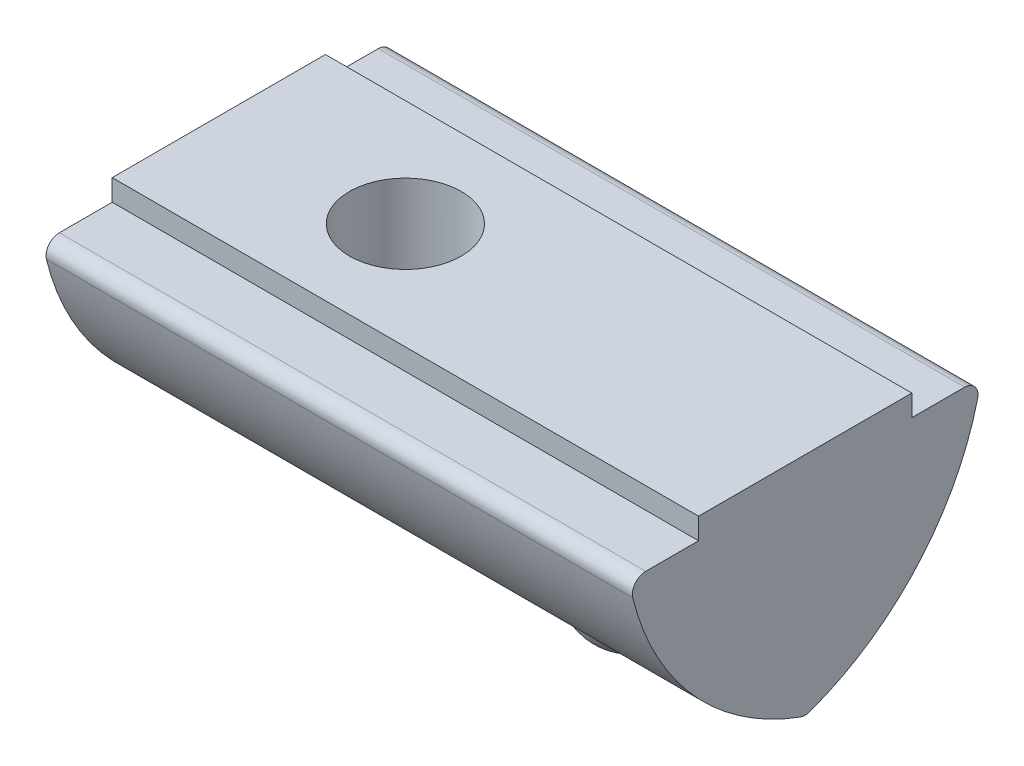
ISO-10303-21;
HEADER;
FILE_DESCRIPTION(('STEP AP214'),'2;1');
FILE_NAME('part.step','',(''),(''),'','','');
FILE_SCHEMA(('AUTOMOTIVE_DESIGN { 1 0 10303 214 1 1 1 1 }'));
ENDSEC;
DATA;
#1=APPLICATION_CONTEXT('core data for automotive mechanical design processes');
#2=APPLICATION_PROTOCOL_DEFINITION('international standard','automotive_design',2000,#1);
#3=PRODUCT_CONTEXT('',#1,'mechanical');
#4=PRODUCT('Part','Part','',(#3));
#5=PRODUCT_RELATED_PRODUCT_CATEGORY('part','',(#4));
#6=PRODUCT_DEFINITION_FORMATION('','',#4);
#7=PRODUCT_DEFINITION_CONTEXT('part definition',#1,'design');
#8=PRODUCT_DEFINITION('design','',#6,#7);
#9=PRODUCT_DEFINITION_SHAPE('','',#8);
#10=(LENGTH_UNIT() NAMED_UNIT(*) SI_UNIT(.MILLI.,.METRE.));
#11=(NAMED_UNIT(*) PLANE_ANGLE_UNIT() SI_UNIT($,.RADIAN.));
#12=(NAMED_UNIT(*) SI_UNIT($,.STERADIAN.) SOLID_ANGLE_UNIT());
#13=UNCERTAINTY_MEASURE_WITH_UNIT(LENGTH_MEASURE(1.E-05),#10,'distance_accuracy_value','');
#14=(GEOMETRIC_REPRESENTATION_CONTEXT(3) GLOBAL_UNCERTAINTY_ASSIGNED_CONTEXT((#13)) GLOBAL_UNIT_ASSIGNED_CONTEXT((#10,
#11,#12)) REPRESENTATION_CONTEXT('',''));
#15=CARTESIAN_POINT('',(0.,0.,0.));
#16=DIRECTION('',(0.,0.,1.));
#17=DIRECTION('',(1.,0.,0.));
#18=AXIS2_PLACEMENT_3D('',#15,#16,#17);
#19=CARTESIAN_POINT('',(11.,0.959183646170856,-3.24404758719933));
#20=DIRECTION('',(-1.,0.,0.));
#21=DIRECTION('',(0.,0.,1.));
#22=AXIS2_PLACEMENT_3D('',#19,#20,#21);
#23=CYLINDRICAL_SURFACE('',#22,10.);
#24=CARTESIAN_POINT('',(6.13456672228231,-8.43978417326976,0.170539346694701));
#25=CARTESIAN_POINT('',(6.14166085840546,-8.42248365589155,0.2181665216488));
#26=CARTESIAN_POINT('',(6.14665879114965,-8.40472523263232,0.265912873596706));
#27=CARTESIAN_POINT('',(6.15244603553675,-8.36839441075964,0.36134971753672));
#28=CARTESIAN_POINT('',(6.15323543931309,-8.3498220299744,0.409040210728841));
#29=CARTESIAN_POINT('',(6.14926881574427,-8.29306343560497,0.55151969439376));
#30=CARTESIAN_POINT('',(6.13818845474531,-8.25380996527598,0.645787766107359));
#31=CARTESIAN_POINT('',(6.09932704187162,-8.17377675893438,0.830159453493736));
#32=CARTESIAN_POINT('',(6.07153616583461,-8.13299613834079,0.920260585827474));
#33=CARTESIAN_POINT('',(5.99977773053169,-8.05149297446569,1.09379631955834));
#34=CARTESIAN_POINT('',(5.95581563761775,-8.01077041622156,1.17723316209691));
#35=CARTESIAN_POINT('',(5.85316012054617,-7.9316421563531,1.33425738872361));
#36=CARTESIAN_POINT('',(5.79462755953727,-7.89321649285333,1.40793968418131));
#37=CARTESIAN_POINT('',(5.66391812024963,-7.82019424272126,1.54432549342461));
#38=CARTESIAN_POINT('',(5.59174210091069,-7.78559741525739,1.60702969787028));
#39=CARTESIAN_POINT('',(5.43897843437988,-7.72363665580135,1.71704700919064));
#40=CARTESIAN_POINT('',(5.35888273628127,-7.69602661475469,1.76490379615891));
#41=CARTESIAN_POINT('',(5.19012341443222,-7.64788627358764,1.84718335212784));
#42=CARTESIAN_POINT('',(5.10146357337497,-7.62735286593229,1.8816120186446));
#43=CARTESIAN_POINT('',(4.92346558324823,-7.5956577718355,1.93432916047736));
#44=CARTESIAN_POINT('',(4.83444589045712,-7.58403404347301,1.95341632928833));
#45=CARTESIAN_POINT('',(4.65387123890333,-7.56906162249086,1.9779487731012));
#46=CARTESIAN_POINT('',(4.56231695630393,-7.56571074399448,1.98339765165752));
#47=CARTESIAN_POINT('',(4.3831607827305,-7.56746468579052,1.98053526468532));
#48=CARTESIAN_POINT('',(4.29554632740017,-7.5722389781528,1.97276188094082));
#49=CARTESIAN_POINT('',(4.12310505790691,-7.58932092764151,1.94472254921313));
#50=CARTESIAN_POINT('',(4.03827812192198,-7.60162825509171,1.92445714793111));
#51=CARTESIAN_POINT('',(3.87370324970061,-7.6330553938988,1.87204020240071));
#52=CARTESIAN_POINT('',(3.79395670268463,-7.65217705927514,1.83988542324555));
#53=CARTESIAN_POINT('',(3.64155632811411,-7.69617905215401,1.76460395255946));
#54=CARTESIAN_POINT('',(3.56890362479224,-7.72106029033459,1.72147552581705));
#55=CARTESIAN_POINT('',(3.42973117829016,-7.77636389030842,1.62354737391395));
#56=CARTESIAN_POINT('',(3.36354958016113,-7.80696094330033,1.56836628576492));
#57=CARTESIAN_POINT('',(3.2420111329999,-7.87152558903947,1.4488389283959));
#58=CARTESIAN_POINT('',(3.18665601784167,-7.90549372035791,1.38449119397414));
#59=CARTESIAN_POINT('',(3.08515563469648,-7.97722182893185,1.24451105673976));
#60=CARTESIAN_POINT('',(3.03966484752015,-8.01508747744342,1.16845814392302));
#61=CARTESIAN_POINT('',(2.96269470429401,-8.09138223257182,1.00977526054019));
#62=CARTESIAN_POINT('',(2.93122467629806,-8.12981169679074,0.927140954311092));
#63=CARTESIAN_POINT('',(2.88174558754636,-8.20758580144715,0.753427809688063));
#64=CARTESIAN_POINT('',(2.86442492833677,-8.24689080482885,0.662135244938334));
#65=CARTESIAN_POINT('',(2.84607991283625,-8.32320300699888,0.477141748099445));
#66=CARTESIAN_POINT('',(2.84502658124792,-8.36021417437015,0.383445395987207));
#67=CARTESIAN_POINT('',(2.85505798785469,-8.41062869408612,0.250016672212722));
#68=CARTESIAN_POINT('',(2.85951465204512,-8.42537502527711,0.210218321169013));
#69=CARTESIAN_POINT('',(2.86543327771759,-8.43978417326976,0.170539346694695));
#70=B_SPLINE_CURVE_WITH_KNOTS('',3,(#24,#25,#26,#27,#28,#29,#30,#31,#32,#33,#34,#35,#36,#37,#38,
#39,#40,#41,#42,#43,#44,#45,#46,#47,#48,#49,#50,#51,#52,#53,#54,#55,#56,#57,#58,#59,#60,#61,#62,
#63,#64,#65,#66,#67,#68,#69),.UNSPECIFIED.,.F.,.F.,(4,2,2,2,2,2,2,2,2,2,2,2,2,2,2,2,2,2,2,2,2,2,
4),(0.,0.153404302316358,0.306805246280148,0.613380981770518,0.92013713052628,1.22678968173144,
1.53019619043653,1.8335836041896,2.12399193236017,2.41427257165683,2.68823102528617,
2.96211708505643,3.22512592281603,3.48812325106292,3.75119218933334,4.01430275134187,
4.28741562449719,4.56057220124838,4.84840242317601,5.13642385451082,5.43774015580749,
5.73851969171597,5.86643517958048),.UNSPECIFIED.);
#71=CARTESIAN_POINT('',(6.1345965082198,-8.43971151209677,0.1707393466947));
#72=VERTEX_POINT('',#71);
#73=CARTESIAN_POINT('',(2.8654034917802,-8.43971151209677,0.170739346694701));
#74=VERTEX_POINT('',#73);
#75=EDGE_CURVE('E61',#72,#74,#70,.T.);
#76=ORIENTED_EDGE('',*,*,#75,.F.);
#77=DIRECTION('',(-1.,0.,0.));
#78=VECTOR('',#77,1.);
#79=CARTESIAN_POINT('',(11.,-8.43971151209677,0.170739346694701));
#80=LINE('',#79,#78);
#81=CARTESIAN_POINT('',(11.,-8.43971151209677,0.170739346694701));
#82=VERTEX_POINT('',#81);
#83=EDGE_CURVE('E75',#72,#82,#80,.F.);
#84=ORIENTED_EDGE('',*,*,#83,.T.);
#85=CARTESIAN_POINT('',(11.,0.959183646170856,-3.24404758719933));
#86=DIRECTION('',(1.,0.,0.));
#87=DIRECTION('',(0.,0.,-1.));
#88=AXIS2_PLACEMENT_3D('',#85,#86,#87);
#89=CIRCLE('',#88,10.);
#90=CARTESIAN_POINT('',(11.,-1.41890440243005,6.46907226345121));
#91=VERTEX_POINT('',#90);
#92=EDGE_CURVE('E322',#91,#82,#89,.T.);
#93=ORIENTED_EDGE('',*,*,#92,.F.);
#94=DIRECTION('',(-1.,0.,0.));
#95=VECTOR('',#94,1.);
#96=CARTESIAN_POINT('',(11.,-1.41890440243005,6.46907226345121));
#97=LINE('',#96,#95);
#98=CARTESIAN_POINT('',(-11.,-1.41890440243005,6.46907226345121));
#99=VERTEX_POINT('',#98);
#100=EDGE_CURVE('E185',#91,#99,#97,.T.);
#101=ORIENTED_EDGE('',*,*,#100,.T.);
#102=CARTESIAN_POINT('',(-11.,0.959183646170856,-3.24404758719933));
#103=DIRECTION('',(1.,0.,0.));
#104=DIRECTION('',(0.,0.,-1.));
#105=AXIS2_PLACEMENT_3D('',#102,#103,#104);
#106=CIRCLE('',#105,10.);
#107=CARTESIAN_POINT('',(-11.,-8.43971151209677,0.170739346694701));
#108=VERTEX_POINT('',#107);
#109=EDGE_CURVE('E306',#99,#108,#106,.T.);
#110=ORIENTED_EDGE('',*,*,#109,.T.);
#111=CARTESIAN_POINT('',(-6.0930475569108,-8.43971151209677,0.170739346694696));
#112=VERTEX_POINT('',#111);
#113=EDGE_CURVE('E190',#108,#112,#80,.F.);
#114=ORIENTED_EDGE('',*,*,#113,.T.);
#115=CARTESIAN_POINT('',(-6.0930475569108,-8.43971151209677,0.170739346694696));
#116=CARTESIAN_POINT('',(-6.08784951992059,-8.41657566040288,0.234429584835297));
#117=CARTESIAN_POINT('',(-6.07976877801095,-8.39287431099568,0.297635391447042));
#118=CARTESIAN_POINT('',(-6.05799933149116,-8.34455130127524,0.422694442950031));
#119=CARTESIAN_POINT('',(-6.0443123198008,-8.31992992082078,0.484548090217303));
#120=CARTESIAN_POINT('',(-5.99512173334344,-8.24505796955417,0.667372636824643));
#121=CARTESIAN_POINT('',(-5.95147140255796,-8.19372616021422,0.785808043261356));
#122=CARTESIAN_POINT('',(-5.84400139568146,-8.09047053687792,1.01263189371261));
#123=CARTESIAN_POINT('',(-5.78019681782185,-8.03854719399633,1.12102778031654));
#124=CARTESIAN_POINT('',(-5.63375255027643,-7.9365065307461,1.32538790498134));
#125=CARTESIAN_POINT('',(-5.5511024420098,-7.88639022719877,1.4213452202916));
#126=CARTESIAN_POINT('',(-5.36765406604185,-7.79054508274423,1.59873120819588));
#127=CARTESIAN_POINT('',(-5.26670904784925,-7.74485667571409,1.68003093677407));
#128=CARTESIAN_POINT('',(-5.0491155338509,-7.66193274333532,1.82381788813684));
#129=CARTESIAN_POINT('',(-4.93248217601335,-7.62468916132422,1.88632306032276));
#130=CARTESIAN_POINT('',(-4.69933957412089,-7.56567537930104,1.98373446213052));
#131=CARTESIAN_POINT('',(-4.58405076311003,-7.54270789371099,2.02081770732173));
#132=CARTESIAN_POINT('',(-4.34713778276227,-7.50913733888363,2.07465394341067));
#133=CARTESIAN_POINT('',(-4.22552290916532,-7.49851663471578,2.0914359320254));
#134=CARTESIAN_POINT('',(-3.9987309434421,-7.49145349827924,2.10260981382135));
#135=CARTESIAN_POINT('',(-3.89374271346917,-7.49316950209997,2.09990966318821));
#136=CARTESIAN_POINT('',(-3.68595642468966,-7.5063487573263,2.07900732408726));
#137=CARTESIAN_POINT('',(-3.58315822614996,-7.5178113849359,2.06080612770548));
#138=CARTESIAN_POINT('',(-3.38627273217212,-7.54889728854221,2.01079551828081));
#139=CARTESIAN_POINT('',(-3.29200555832934,-7.56821517805778,1.97949418992335));
#140=CARTESIAN_POINT('',(-3.11019385073335,-7.61357629202151,1.90470885257996));
#141=CARTESIAN_POINT('',(-3.02265100534786,-7.63962119839753,1.8612217966164));
#142=CARTESIAN_POINT('',(-2.8474734946188,-7.69971521208763,1.75868439124481));
#143=CARTESIAN_POINT('',(-2.76067397303569,-7.73429916853744,1.69852509739834));
#144=CARTESIAN_POINT('',(-2.59806660461083,-7.80776335288986,1.56701447237437));
#145=CARTESIAN_POINT('',(-2.52226577358756,-7.84664629540309,1.49565605740427));
#146=CARTESIAN_POINT('',(-2.37270858443049,-7.93260661563048,1.33259896759552));
#147=CARTESIAN_POINT('',(-2.30074783918822,-7.98006633600325,1.23945098957153));
#148=CARTESIAN_POINT('',(-2.1734970141286,-8.07598051351226,1.04288348682671));
#149=CARTESIAN_POINT('',(-2.11820885987611,-8.12443508485695,0.939462777511257));
#150=CARTESIAN_POINT('',(-2.02693105668447,-8.21886968245955,0.72789112094482));
#151=CARTESIAN_POINT('',(-1.99038013464362,-8.26487926329826,0.619997686141296));
#152=CARTESIAN_POINT('',(-1.94890394607111,-8.33204022259635,0.454159916513098));
#153=CARTESIAN_POINT('',(-1.93730169072364,-8.35412644678052,0.398192088825131));
#154=CARTESIAN_POINT('',(-1.91866823330907,-8.39753238759696,0.285192669931149));
#155=CARTESIAN_POINT('',(-1.91163817430702,-8.41885191129389,0.228160816378067));
#156=CARTESIAN_POINT('',(-1.9069524430892,-8.43971151209677,0.170739346694696));
#157=B_SPLINE_CURVE_WITH_KNOTS('',3,(#115,#116,#117,#118,#119,#120,#121,#122,#123,#124,#125,
#126,#127,#128,#129,#130,#131,#132,#133,#134,#135,#136,#137,#138,#139,#140,#141,#142,#143,#144,
#145,#146,#147,#148,#149,#150,#151,#152,#153,#154,#155,#156),.UNSPECIFIED.,.F.,.F.,(4,2,2,2,2,2,
2,2,2,2,2,2,2,2,2,2,2,2,2,2,4),(0.,0.203742262837634,0.407423047127448,0.814149184109984,
1.22057134846293,1.62721874675163,2.03728532546469,2.44695902446412,2.81450746204076,
3.18153028200054,3.49503643932938,3.80852253338545,4.11083664534663,4.41322641693205,
4.74531022420529,5.07760493775733,5.45675811331798,5.83595506159894,6.2030096225213,
6.38667827607127,6.57039282979267),.UNSPECIFIED.);
#158=CARTESIAN_POINT('',(-1.9069524430892,-8.43971151209677,0.1707393466947));
#159=VERTEX_POINT('',#158);
#160=EDGE_CURVE('E228',#112,#159,#157,.T.);
#161=ORIENTED_EDGE('',*,*,#160,.T.);
#162=EDGE_CURVE('E191',#159,#74,#80,.F.);
#163=ORIENTED_EDGE('',*,*,#162,.T.);
#164=EDGE_LOOP('',(#76,#84,#93,#101,#110,#114,#161,#163));
#165=FACE_BOUND('',#164,.T.);
#166=ADVANCED_FACE('F44',(#165),#23,.T.);
#167=CARTESIAN_POINT('',(11.,0.959183646170855,3.24404758719933));
#168=DIRECTION('',(-1.,0.,0.));
#169=DIRECTION('',(0.,0.,1.));
#170=AXIS2_PLACEMENT_3D('',#167,#168,#169);
#171=CYLINDRICAL_SURFACE('',#170,10.);
#172=DIRECTION('',(-1.,0.,0.));
#173=VECTOR('',#172,1.);
#174=CARTESIAN_POINT('',(11.,-8.43971151209677,-0.170739346694703));
#175=LINE('',#174,#173);
#176=CARTESIAN_POINT('',(11.,-8.43971151209677,-0.170739346694703));
#177=VERTEX_POINT('',#176);
#178=CARTESIAN_POINT('',(6.1345965082198,-8.43971151209677,-0.170739346694702));
#179=VERTEX_POINT('',#178);
#180=EDGE_CURVE('E161',#177,#179,#175,.T.);
#181=ORIENTED_EDGE('',*,*,#180,.T.);
#182=CARTESIAN_POINT('',(6.13456672228231,-8.43978417326976,-0.170539346694702));
#183=CARTESIAN_POINT('',(6.14166085840546,-8.42248365589155,-0.218166521648801));
#184=CARTESIAN_POINT('',(6.14665879114965,-8.40472523263231,-0.265912873596706));
#185=CARTESIAN_POINT('',(6.15244603553675,-8.36839441075964,-0.361349717536721));
#186=CARTESIAN_POINT('',(6.15323543931309,-8.3498220299744,-0.409040210728842));
#187=CARTESIAN_POINT('',(6.14926881574427,-8.29306343560497,-0.551519694393762));
#188=CARTESIAN_POINT('',(6.13818845474531,-8.25380996527598,-0.64578776610736));
#189=CARTESIAN_POINT('',(6.09932704187163,-8.17377675893437,-0.830159453493736));
#190=CARTESIAN_POINT('',(6.07153616583461,-8.13299613834079,-0.920260585827474));
#191=CARTESIAN_POINT('',(5.99977773053169,-8.05149297446569,-1.09379631955834));
#192=CARTESIAN_POINT('',(5.95581563761775,-8.01077041622156,-1.17723316209691));
#193=CARTESIAN_POINT('',(5.85316012054617,-7.9316421563531,-1.33425738872361));
#194=CARTESIAN_POINT('',(5.79462755953727,-7.89321649285333,-1.40793968418131));
#195=CARTESIAN_POINT('',(5.66391812024963,-7.82019424272126,-1.54432549342461));
#196=CARTESIAN_POINT('',(5.59174210091069,-7.78559741525739,-1.60702969787028));
#197=CARTESIAN_POINT('',(5.43897843437988,-7.72363665580135,-1.71704700919064));
#198=CARTESIAN_POINT('',(5.35888273628127,-7.6960266147547,-1.76490379615891));
#199=CARTESIAN_POINT('',(5.19012341443222,-7.64788627358764,-1.84718335212784));
#200=CARTESIAN_POINT('',(5.10146357337497,-7.62735286593229,-1.8816120186446));
#201=CARTESIAN_POINT('',(4.92346558324822,-7.5956577718355,-1.93432916047736));
#202=CARTESIAN_POINT('',(4.83444589045712,-7.58403404347301,-1.95341632928833));
#203=CARTESIAN_POINT('',(4.65387123890333,-7.56906162249086,-1.9779487731012));
#204=CARTESIAN_POINT('',(4.56231695630393,-7.56571074399448,-1.98339765165752));
#205=CARTESIAN_POINT('',(4.3831607827305,-7.56746468579052,-1.98053526468532));
#206=CARTESIAN_POINT('',(4.29554632740017,-7.5722389781528,-1.97276188094082));
#207=CARTESIAN_POINT('',(4.12310505790691,-7.58932092764151,-1.94472254921312));
#208=CARTESIAN_POINT('',(4.03827812192198,-7.60162825509171,-1.92445714793111));
#209=CARTESIAN_POINT('',(3.87370324970061,-7.6330553938988,-1.87204020240071));
#210=CARTESIAN_POINT('',(3.79395670268463,-7.65217705927514,-1.83988542324555));
#211=CARTESIAN_POINT('',(3.64155632811411,-7.69617905215401,-1.76460395255945));
#212=CARTESIAN_POINT('',(3.56890362479224,-7.72106029033459,-1.72147552581705));
#213=CARTESIAN_POINT('',(3.42973117829016,-7.77636389030842,-1.62354737391394));
#214=CARTESIAN_POINT('',(3.36354958016113,-7.80696094330033,-1.56836628576492));
#215=CARTESIAN_POINT('',(3.2420111329999,-7.87152558903947,-1.4488389283959));
#216=CARTESIAN_POINT('',(3.18665601784166,-7.90549372035791,-1.38449119397414));
#217=CARTESIAN_POINT('',(3.08515563469648,-7.97722182893185,-1.24451105673976));
#218=CARTESIAN_POINT('',(3.03966484752015,-8.01508747744342,-1.16845814392302));
#219=CARTESIAN_POINT('',(2.96269470429401,-8.09138223257182,-1.00977526054019));
#220=CARTESIAN_POINT('',(2.93122467629806,-8.12981169679074,-0.927140954311091));
#221=CARTESIAN_POINT('',(2.88174558754636,-8.20758580144715,-0.753427809688061));
#222=CARTESIAN_POINT('',(2.86442492833677,-8.24689080482885,-0.662135244938332));
#223=CARTESIAN_POINT('',(2.84607991283624,-8.32320300699888,-0.477141748099443));
#224=CARTESIAN_POINT('',(2.84502658124792,-8.36021417437015,-0.383445395987205));
#225=CARTESIAN_POINT('',(2.85505798785469,-8.41062869408612,-0.250016672212722));
#226=CARTESIAN_POINT('',(2.85951465204512,-8.42537502527712,-0.210218321169013));
#227=CARTESIAN_POINT('',(2.86543327771759,-8.43978417326976,-0.170539346694696));
#228=B_SPLINE_CURVE_WITH_KNOTS('',3,(#182,#183,#184,#185,#186,#187,#188,#189,#190,#191,#192,
#193,#194,#195,#196,#197,#198,#199,#200,#201,#202,#203,#204,#205,#206,#207,#208,#209,#210,#211,
#212,#213,#214,#215,#216,#217,#218,#219,#220,#221,#222,#223,#224,#225,#226,#227),.UNSPECIFIED.,
.F.,.F.,(4,2,2,2,2,2,2,2,2,2,2,2,2,2,2,2,2,2,2,2,2,2,4),(0.,0.153404302316357,0.306805246280148,
0.613380981770518,0.92013713052628,1.22678968173144,1.53019619043653,1.8335836041896,
2.12399193236017,2.41427257165683,2.68823102528617,2.96211708505643,3.22512592281603,
3.48812325106292,3.75119218933334,4.01430275134187,4.28741562449718,4.56057220124838,
4.84840242317601,5.13642385451082,5.43774015580749,5.73851969171597,5.86643517958048),.UNSPECIFIED.);
#229=CARTESIAN_POINT('',(2.8654034917802,-8.43971151209677,-0.170739346694702));
#230=VERTEX_POINT('',#229);
#231=EDGE_CURVE('E153',#179,#230,#228,.T.);
#232=ORIENTED_EDGE('',*,*,#231,.T.);
#233=CARTESIAN_POINT('',(-1.9069524430892,-8.43971151209677,-0.170739346694703));
#234=VERTEX_POINT('',#233);
#235=EDGE_CURVE('E163',#230,#234,#175,.T.);
#236=ORIENTED_EDGE('',*,*,#235,.T.);
#237=CARTESIAN_POINT('',(-6.0930475569108,-8.43971151209677,-0.170739346694707));
#238=CARTESIAN_POINT('',(-6.08784951992059,-8.41657566040287,-0.234429584835308));
#239=CARTESIAN_POINT('',(-6.07976877801095,-8.39287431099567,-0.297635391447054));
#240=CARTESIAN_POINT('',(-6.05799933149116,-8.34455130127524,-0.422694442950042));
#241=CARTESIAN_POINT('',(-6.0443123198008,-8.31992992082077,-0.484548090217315));
#242=CARTESIAN_POINT('',(-5.99512173334343,-8.24505796955416,-0.667372636824654));
#243=CARTESIAN_POINT('',(-5.95147140255796,-8.19372616021422,-0.785808043261368));
#244=CARTESIAN_POINT('',(-5.84400139568146,-8.09047053687791,-1.01263189371262));
#245=CARTESIAN_POINT('',(-5.78019681782185,-8.03854719399632,-1.12102778031655));
#246=CARTESIAN_POINT('',(-5.63375255027643,-7.93650653074609,-1.32538790498135));
#247=CARTESIAN_POINT('',(-5.55110244200979,-7.88639022719877,-1.42134522029161));
#248=CARTESIAN_POINT('',(-5.36765406604184,-7.79054508274423,-1.59873120819588));
#249=CARTESIAN_POINT('',(-5.26670904784924,-7.74485667571409,-1.68003093677408));
#250=CARTESIAN_POINT('',(-5.04911553385089,-7.66193274333532,-1.82381788813685));
#251=CARTESIAN_POINT('',(-4.93248217601333,-7.62468916132422,-1.88632306032277));
#252=CARTESIAN_POINT('',(-4.69933957412087,-7.56567537930104,-1.98373446213052));
#253=CARTESIAN_POINT('',(-4.58405076311001,-7.54270789371099,-2.02081770732173));
#254=CARTESIAN_POINT('',(-4.34713778276226,-7.50913733888362,-2.07465394341067));
#255=CARTESIAN_POINT('',(-4.22552290916531,-7.49851663471578,-2.0914359320254));
#256=CARTESIAN_POINT('',(-3.99873094344209,-7.49145349827924,-2.10260981382135));
#257=CARTESIAN_POINT('',(-3.89374271346916,-7.49316950209997,-2.09990966318821));
#258=CARTESIAN_POINT('',(-3.68595642468965,-7.5063487573263,-2.07900732408725));
#259=CARTESIAN_POINT('',(-3.58315822614995,-7.5178113849359,-2.06080612770548));
#260=CARTESIAN_POINT('',(-3.38627273217211,-7.54889728854221,-2.01079551828081));
#261=CARTESIAN_POINT('',(-3.29200555832933,-7.56821517805778,-1.97949418992334));
#262=CARTESIAN_POINT('',(-3.11019385073334,-7.61357629202152,-1.90470885257996));
#263=CARTESIAN_POINT('',(-3.02265100534785,-7.63962119839753,-1.86122179661639));
#264=CARTESIAN_POINT('',(-2.84747349461879,-7.69971521208764,-1.7586843912448));
#265=CARTESIAN_POINT('',(-2.76067397303568,-7.73429916853744,-1.69852509739833));
#266=CARTESIAN_POINT('',(-2.59806660461082,-7.80776335288987,-1.56701447237437));
#267=CARTESIAN_POINT('',(-2.52226577358755,-7.8466462954031,-1.49565605740426));
#268=CARTESIAN_POINT('',(-2.37270858443049,-7.93260661563048,-1.33259896759551));
#269=CARTESIAN_POINT('',(-2.30074783918822,-7.98006633600326,-1.23945098957152));
#270=CARTESIAN_POINT('',(-2.1734970141286,-8.07598051351227,-1.0428834868267));
#271=CARTESIAN_POINT('',(-2.1182088598761,-8.12443508485696,-0.939462777511244));
#272=CARTESIAN_POINT('',(-2.02693105668447,-8.21886968245955,-0.72789112094481));
#273=CARTESIAN_POINT('',(-1.99038013464362,-8.26487926329826,-0.61999768614129));
#274=CARTESIAN_POINT('',(-1.94890394607111,-8.33204022259635,-0.454159916513099));
#275=CARTESIAN_POINT('',(-1.93730169072364,-8.35412644678052,-0.398192088825135));
#276=CARTESIAN_POINT('',(-1.91866823330907,-8.39753238759696,-0.285192669931156));
#277=CARTESIAN_POINT('',(-1.91163817430702,-8.41885191129389,-0.228160816378077));
#278=CARTESIAN_POINT('',(-1.9069524430892,-8.43971151209677,-0.170739346694707));
#279=B_SPLINE_CURVE_WITH_KNOTS('',3,(#237,#238,#239,#240,#241,#242,#243,#244,#245,#246,#247,
#248,#249,#250,#251,#252,#253,#254,#255,#256,#257,#258,#259,#260,#261,#262,#263,#264,#265,#266,
#267,#268,#269,#270,#271,#272,#273,#274,#275,#276,#277,#278),.UNSPECIFIED.,.F.,.F.,(4,2,2,2,2,2,
2,2,2,2,2,2,2,2,2,2,2,2,2,2,4),(0.,0.203742262837635,0.407423047127448,0.814149184109986,
1.22057134846293,1.62721874675163,2.0372853254647,2.44695902446412,2.81450746204076,
3.18153028200054,3.49503643932938,3.80852253338545,4.11083664534663,4.41322641693205,
4.74531022420529,5.07760493775733,5.45675811331798,5.83595506159895,6.20300962252129,
6.38667827607126,6.57039282979265),.UNSPECIFIED.);
#280=CARTESIAN_POINT('',(-6.0930475569108,-8.43971151209677,-0.170739346694707));
#281=VERTEX_POINT('',#280);
#282=EDGE_CURVE('E219',#281,#234,#279,.T.);
#283=ORIENTED_EDGE('',*,*,#282,.F.);
#284=CARTESIAN_POINT('',(-11.,-8.43971151209677,-0.170739346694703));
#285=VERTEX_POINT('',#284);
#286=EDGE_CURVE('E166',#281,#285,#175,.T.);
#287=ORIENTED_EDGE('',*,*,#286,.T.);
#288=CARTESIAN_POINT('',(-11.,0.959183646170855,3.24404758719933));
#289=DIRECTION('',(-1.,0.,0.));
#290=DIRECTION('',(0.,0.,1.));
#291=AXIS2_PLACEMENT_3D('',#288,#289,#290);
#292=CIRCLE('',#291,10.);
#293=CARTESIAN_POINT('',(-11.,-1.41890440243006,-6.46907226345121));
#294=VERTEX_POINT('',#293);
#295=EDGE_CURVE('E303',#294,#285,#292,.T.);
#296=ORIENTED_EDGE('',*,*,#295,.F.);
#297=DIRECTION('',(-1.,0.,0.));
#298=VECTOR('',#297,1.);
#299=CARTESIAN_POINT('',(11.,-1.41890440243006,-6.46907226345121));
#300=LINE('',#299,#298);
#301=CARTESIAN_POINT('',(11.,-1.41890440243006,-6.46907226345121));
#302=VERTEX_POINT('',#301);
#303=EDGE_CURVE('E175',#294,#302,#300,.F.);
#304=ORIENTED_EDGE('',*,*,#303,.T.);
#305=CARTESIAN_POINT('',(11.,0.959183646170855,3.24404758719933));
#306=DIRECTION('',(-1.,0.,0.));
#307=DIRECTION('',(0.,0.,1.));
#308=AXIS2_PLACEMENT_3D('',#305,#306,#307);
#309=CIRCLE('',#308,10.);
#310=EDGE_CURVE('E318',#302,#177,#309,.T.);
#311=ORIENTED_EDGE('',*,*,#310,.T.);
#312=EDGE_LOOP('',(#181,#232,#236,#283,#287,#296,#304,#311));
#313=FACE_BOUND('',#312,.T.);
#314=ADVANCED_FACE('F159',(#313),#171,.T.);
#315=CARTESIAN_POINT('',(11.,-7.96976675418339,0.));
#316=DIRECTION('',(-1.,0.,0.));
#317=DIRECTION('',(0.,0.,1.));
#318=AXIS2_PLACEMENT_3D('',#315,#316,#317);
#319=CYLINDRICAL_SURFACE('',#318,0.5);
#320=ORIENTED_EDGE('',*,*,#83,.F.);
#321=CARTESIAN_POINT('',(6.13462630118634,-8.43963880033169,0.1709393466947));
#322=CARTESIAN_POINT('',(6.13097939779937,-8.44853348906789,0.146578052378125));
#323=CARTESIAN_POINT('',(6.12810842956108,-8.45551606356672,0.121398949590083));
#324=CARTESIAN_POINT('',(6.12399456022071,-8.46550693742857,0.0701170143092289));
#325=CARTESIAN_POINT('',(6.12275283426363,-8.46851236815822,0.0440135289963956));
#326=CARTESIAN_POINT('',(6.12197863217668,-8.47038684194172,-0.00840171006878134));
#327=CARTESIAN_POINT('',(6.12244835454961,-8.46925056461409,-0.034713688348816));
#328=CARTESIAN_POINT('',(6.12507398030983,-8.4628854605071,-0.086695767861616));
#329=CARTESIAN_POINT('',(6.12722597305793,-8.45766612526497,-0.11236721544858));
#330=CARTESIAN_POINT('',(6.13148982218322,-8.44728735948564,-0.148711000041808));
#331=CARTESIAN_POINT('',(6.1329804646782,-8.44365505786299,-0.159910832586944));
#332=CARTESIAN_POINT('',(6.13462630118637,-8.43963880033169,-0.1709393466947));
#333=B_SPLINE_CURVE_WITH_KNOTS('',3,(#321,#322,#323,#324,#325,#326,#327,#328,#329,#330,#331,
#332),.UNSPECIFIED.,.F.,.F.,(4,2,2,2,2,4),(0.,0.0784853973044673,0.157027373739303,
0.235670279659068,0.314130912390276,0.349698239136237),.UNSPECIFIED.);
#334=EDGE_CURVE('E11',#72,#179,#333,.T.);
#335=ORIENTED_EDGE('',*,*,#334,.T.);
#336=ORIENTED_EDGE('',*,*,#180,.F.);
#337=CARTESIAN_POINT('',(11.,-7.96976675418339,0.));
#338=DIRECTION('',(1.,0.,0.));
#339=DIRECTION('',(0.,0.,-1.));
#340=AXIS2_PLACEMENT_3D('',#337,#338,#339);
#341=CIRCLE('',#340,0.5);
#342=EDGE_CURVE('E179',#82,#177,#341,.T.);
#343=ORIENTED_EDGE('',*,*,#342,.F.);
#344=EDGE_LOOP('',(#320,#335,#336,#343));
#345=FACE_BOUND('',#344,.T.);
#346=ADVANCED_FACE('F202',(#345),#319,.T.);
#347=ORIENTED_EDGE('',*,*,#235,.F.);
#348=CARTESIAN_POINT('',(2.86537369881366,-8.43963880033169,-0.170939346694701));
#349=CARTESIAN_POINT('',(2.86902060220063,-8.44853348906789,-0.146578052378127));
#350=CARTESIAN_POINT('',(2.87189157043892,-8.45551606356672,-0.121398949590085));
#351=CARTESIAN_POINT('',(2.87600543977929,-8.46550693742857,-0.0701170143092307));
#352=CARTESIAN_POINT('',(2.87724716573637,-8.46851236815822,-0.0440135289963973));
#353=CARTESIAN_POINT('',(2.87802136782332,-8.47038684194172,0.00840171006877959));
#354=CARTESIAN_POINT('',(2.87755164545039,-8.46925056461409,0.0347136883488142));
#355=CARTESIAN_POINT('',(2.87492601969017,-8.4628854605071,0.0866957678616143));
#356=CARTESIAN_POINT('',(2.87277402694207,-8.45766612526497,0.112367215448579));
#357=CARTESIAN_POINT('',(2.86851017781678,-8.44728735948564,0.148711000041806));
#358=CARTESIAN_POINT('',(2.8670195353218,-8.44365505786299,0.159910832586942));
#359=CARTESIAN_POINT('',(2.86537369881364,-8.43963880033169,0.170939346694698));
#360=B_SPLINE_CURVE_WITH_KNOTS('',3,(#348,#349,#350,#351,#352,#353,#354,#355,#356,#357,#358,
#359),.UNSPECIFIED.,.F.,.F.,(4,2,2,2,2,4),(0.,0.0784853973044672,0.157027373739303,
0.235670279659068,0.314130912390276,0.349698239136237),.UNSPECIFIED.);
#361=EDGE_CURVE('E59',#230,#74,#360,.T.);
#362=ORIENTED_EDGE('',*,*,#361,.T.);
#363=ORIENTED_EDGE('',*,*,#162,.F.);
#364=CARTESIAN_POINT('',(-1.9069524430892,-8.43971151209677,-0.170739346694703));
#365=CARTESIAN_POINT('',(-1.90480344938161,-8.44922669202237,-0.144615680774433));
#366=CARTESIAN_POINT('',(-1.90311496946608,-8.45652985235777,-0.117655295329508));
#367=CARTESIAN_POINT('',(-1.90080029857912,-8.46642949033884,-0.0636582243257917));
#368=CARTESIAN_POINT('',(-1.90014447499304,-8.46915741351929,-0.036646845873037));
#369=CARTESIAN_POINT('',(-1.89988529449048,-8.47025133658961,0.0205625613334395));
#370=CARTESIAN_POINT('',(-1.9004105384193,-8.46808422475631,0.0507725894335902));
#371=CARTESIAN_POINT('',(-1.9027164315536,-8.45823282534621,0.11127670432879));
#372=CARTESIAN_POINT('',(-1.90453867470292,-8.4503655838876,0.141539501119203));
#373=CARTESIAN_POINT('',(-1.9069524430892,-8.43971151209677,0.1707393466947));
#374=B_SPLINE_CURVE_WITH_KNOTS('',3,(#364,#365,#366,#367,#368,#369,#370,#371,#372,#373),
.UNSPECIFIED.,.F.,.F.,(4,2,2,2,4),(0.,0.0835449050991105,0.164645665361031,0.254998427197186,
0.348387434751738),.UNSPECIFIED.);
#375=EDGE_CURVE('E168',#234,#159,#374,.T.);
#376=ORIENTED_EDGE('',*,*,#375,.F.);
#377=EDGE_LOOP('',(#347,#362,#363,#376));
#378=FACE_BOUND('',#377,.T.);
#379=ADVANCED_FACE('F170',(#378),#319,.T.);
#380=CARTESIAN_POINT('',(-6.0930475569108,-8.43971151209677,0.1707393466947));
#381=CARTESIAN_POINT('',(-6.09519655061839,-8.44922669202237,0.144615680774431));
#382=CARTESIAN_POINT('',(-6.09688503053392,-8.45652985235777,0.117655295329506));
#383=CARTESIAN_POINT('',(-6.09919970142088,-8.46642949033884,0.0636582243257894));
#384=CARTESIAN_POINT('',(-6.09985552500696,-8.46915741351929,0.0366468458730348));
#385=CARTESIAN_POINT('',(-6.10011470550952,-8.47025133658961,-0.0205625613334418));
#386=CARTESIAN_POINT('',(-6.0995894615807,-8.46808422475631,-0.0507725894335924));
#387=CARTESIAN_POINT('',(-6.0972835684464,-8.45823282534621,-0.111276704328792));
#388=CARTESIAN_POINT('',(-6.09546132529708,-8.4503655838876,-0.141539501119206));
#389=CARTESIAN_POINT('',(-6.0930475569108,-8.43971151209677,-0.170739346694703));
#390=B_SPLINE_CURVE_WITH_KNOTS('',3,(#380,#381,#382,#383,#384,#385,#386,#387,#388,#389),
.UNSPECIFIED.,.F.,.F.,(4,2,2,2,4),(0.,0.0835449050991104,0.16464566536103,0.254998427197186,
0.348387434751738),.UNSPECIFIED.);
#391=EDGE_CURVE('E157',#112,#281,#390,.T.);
#392=ORIENTED_EDGE('',*,*,#391,.F.);
#393=ORIENTED_EDGE('',*,*,#113,.F.);
#394=CARTESIAN_POINT('',(-11.,-7.96976675418339,0.));
#395=DIRECTION('',(1.,0.,0.));
#396=DIRECTION('',(0.,0.,-1.));
#397=AXIS2_PLACEMENT_3D('',#394,#395,#396);
#398=CIRCLE('',#397,0.5);
#399=EDGE_CURVE('E293',#285,#108,#398,.F.);
#400=ORIENTED_EDGE('',*,*,#399,.F.);
#401=ORIENTED_EDGE('',*,*,#286,.F.);
#402=EDGE_LOOP('',(#392,#393,#400,#401));
#403=FACE_BOUND('',#402,.T.);
#404=ADVANCED_FACE('F340',(#403),#319,.T.);
#405=CARTESIAN_POINT('',(11.,-0.8,4.));
#406=DIRECTION('',(0.,-1.,0.));
#407=DIRECTION('',(0.,0.,-1.));
#408=AXIS2_PLACEMENT_3D('',#405,#406,#407);
#409=PLANE('',#408);
#410=DIRECTION('',(0.,0.,1.));
#411=VECTOR('',#410,1.);
#412=CARTESIAN_POINT('',(-11.,-0.8,4.));
#413=LINE('',#412,#411);
#414=CARTESIAN_POINT('',(-11.,-0.8,4.));
#415=VERTEX_POINT('',#414);
#416=CARTESIAN_POINT('',(-11.,-0.800000000000008,5.98341627091868));
#417=VERTEX_POINT('',#416);
#418=EDGE_CURVE('E329',#415,#417,#413,.T.);
#419=ORIENTED_EDGE('',*,*,#418,.T.);
#420=DIRECTION('',(-1.,0.,0.));
#421=VECTOR('',#420,1.);
#422=CARTESIAN_POINT('',(11.,-0.800000000000008,5.98341627091868));
#423=LINE('',#422,#421);
#424=CARTESIAN_POINT('',(11.,-0.800000000000008,5.98341627091868));
#425=VERTEX_POINT('',#424);
#426=EDGE_CURVE('E187',#417,#425,#423,.F.);
#427=ORIENTED_EDGE('',*,*,#426,.T.);
#428=DIRECTION('',(0.,0.,1.));
#429=VECTOR('',#428,1.);
#430=CARTESIAN_POINT('',(11.,-0.8,4.));
#431=LINE('',#430,#429);
#432=CARTESIAN_POINT('',(11.,-0.8,4.));
#433=VERTEX_POINT('',#432);
#434=EDGE_CURVE('E274',#433,#425,#431,.T.);
#435=ORIENTED_EDGE('',*,*,#434,.F.);
#436=DIRECTION('',(-1.,0.,0.));
#437=VECTOR('',#436,1.);
#438=CARTESIAN_POINT('',(11.,-0.8,4.));
#439=LINE('',#438,#437);
#440=EDGE_CURVE('E282',#433,#415,#439,.T.);
#441=ORIENTED_EDGE('',*,*,#440,.T.);
#442=EDGE_LOOP('',(#419,#427,#435,#441));
#443=FACE_BOUND('',#442,.T.);
#444=ADVANCED_FACE('F349',(#443),#409,.F.);
#445=CARTESIAN_POINT('',(11.,-0.8,-4.));
#446=DIRECTION('',(0.,1.,0.));
#447=DIRECTION('',(0.,0.,1.));
#448=AXIS2_PLACEMENT_3D('',#445,#446,#447);
#449=PLANE('',#448);
#450=DIRECTION('',(0.,0.,-1.));
#451=VECTOR('',#450,1.);
#452=CARTESIAN_POINT('',(11.,-0.8,-4.));
#453=LINE('',#452,#451);
#454=CARTESIAN_POINT('',(11.,-0.8,-4.));
#455=VERTEX_POINT('',#454);
#456=CARTESIAN_POINT('',(11.,-0.800000000000009,-5.98341627091868));
#457=VERTEX_POINT('',#456);
#458=EDGE_CURVE('E317',#455,#457,#453,.T.);
#459=ORIENTED_EDGE('',*,*,#458,.T.);
#460=DIRECTION('',(-1.,0.,0.));
#461=VECTOR('',#460,1.);
#462=CARTESIAN_POINT('',(11.,-0.800000000000009,-5.98341627091868));
#463=LINE('',#462,#461);
#464=CARTESIAN_POINT('',(-11.,-0.800000000000009,-5.98341627091868));
#465=VERTEX_POINT('',#464);
#466=EDGE_CURVE('E290',#457,#465,#463,.T.);
#467=ORIENTED_EDGE('',*,*,#466,.T.);
#468=DIRECTION('',(0.,0.,-1.));
#469=VECTOR('',#468,1.);
#470=CARTESIAN_POINT('',(-11.,-0.8,-4.));
#471=LINE('',#470,#469);
#472=CARTESIAN_POINT('',(-11.,-0.8,-4.));
#473=VERTEX_POINT('',#472);
#474=EDGE_CURVE('E280',#473,#465,#471,.T.);
#475=ORIENTED_EDGE('',*,*,#474,.F.);
#476=DIRECTION('',(-1.,0.,0.));
#477=VECTOR('',#476,1.);
#478=CARTESIAN_POINT('',(11.,-0.8,-4.));
#479=LINE('',#478,#477);
#480=EDGE_CURVE('E289',#455,#473,#479,.T.);
#481=ORIENTED_EDGE('',*,*,#480,.F.);
#482=EDGE_LOOP('',(#459,#467,#475,#481));
#483=FACE_BOUND('',#482,.T.);
#484=ADVANCED_FACE('F237',(#483),#449,.T.);
#485=CARTESIAN_POINT('',(11.,0.,-4.));
#486=DIRECTION('',(0.,0.,-1.));
#487=DIRECTION('',(-1.,0.,0.));
#488=AXIS2_PLACEMENT_3D('',#485,#486,#487);
#489=PLANE('',#488);
#490=DIRECTION('',(0.,-1.,0.));
#491=VECTOR('',#490,1.);
#492=CARTESIAN_POINT('',(-11.,0.,-4.));
#493=LINE('',#492,#491);
#494=CARTESIAN_POINT('',(-11.,0.,-4.));
#495=VERTEX_POINT('',#494);
#496=EDGE_CURVE('E273',#495,#473,#493,.T.);
#497=ORIENTED_EDGE('',*,*,#496,.F.);
#498=DIRECTION('',(-1.,0.,0.));
#499=VECTOR('',#498,1.);
#500=CARTESIAN_POINT('',(11.,0.,-4.));
#501=LINE('',#500,#499);
#502=CARTESIAN_POINT('',(11.,0.,-4.));
#503=VERTEX_POINT('',#502);
#504=EDGE_CURVE('E270',#503,#495,#501,.T.);
#505=ORIENTED_EDGE('',*,*,#504,.F.);
#506=DIRECTION('',(0.,-1.,0.));
#507=VECTOR('',#506,1.);
#508=CARTESIAN_POINT('',(11.,0.,-4.));
#509=LINE('',#508,#507);
#510=EDGE_CURVE('E316',#503,#455,#509,.T.);
#511=ORIENTED_EDGE('',*,*,#510,.T.);
#512=ORIENTED_EDGE('',*,*,#480,.T.);
#513=EDGE_LOOP('',(#497,#505,#511,#512));
#514=FACE_BOUND('',#513,.T.);
#515=ADVANCED_FACE('F260',(#514),#489,.T.);
#516=CARTESIAN_POINT('',(11.,0.,4.));
#517=DIRECTION('',(0.,1.,0.));
#518=DIRECTION('',(0.,0.,1.));
#519=AXIS2_PLACEMENT_3D('',#516,#517,#518);
#520=PLANE('',#519);
#521=CARTESIAN_POINT('',(-4.,0.,0.));
#522=DIRECTION('',(0.,1.,0.));
#523=DIRECTION('',(0.,0.,1.));
#524=AXIS2_PLACEMENT_3D('',#521,#522,#523);
#525=CIRCLE('',#524,2.1);
#526=CARTESIAN_POINT('',(-4.,0.,2.1));
#527=VERTEX_POINT('',#526);
#528=EDGE_CURVE('E230',#527,#527,#525,.T.);
#529=ORIENTED_EDGE('',*,*,#528,.F.);
#530=EDGE_LOOP('',(#529));
#531=FACE_BOUND('',#530,.T.);
#532=DIRECTION('',(0.,0.,-1.));
#533=VECTOR('',#532,1.);
#534=CARTESIAN_POINT('',(-11.,0.,4.));
#535=LINE('',#534,#533);
#536=CARTESIAN_POINT('',(-11.,0.,4.));
#537=VERTEX_POINT('',#536);
#538=EDGE_CURVE('E261',#537,#495,#535,.T.);
#539=ORIENTED_EDGE('',*,*,#538,.F.);
#540=DIRECTION('',(-1.,0.,0.));
#541=VECTOR('',#540,1.);
#542=CARTESIAN_POINT('',(11.,0.,4.));
#543=LINE('',#542,#541);
#544=CARTESIAN_POINT('',(11.,0.,4.));
#545=VERTEX_POINT('',#544);
#546=EDGE_CURVE('E262',#545,#537,#543,.T.);
#547=ORIENTED_EDGE('',*,*,#546,.F.);
#548=DIRECTION('',(0.,0.,-1.));
#549=VECTOR('',#548,1.);
#550=CARTESIAN_POINT('',(11.,0.,4.));
#551=LINE('',#550,#549);
#552=EDGE_CURVE('E325',#545,#503,#551,.T.);
#553=ORIENTED_EDGE('',*,*,#552,.T.);
#554=ORIENTED_EDGE('',*,*,#504,.T.);
#555=EDGE_LOOP('',(#539,#547,#553,#554));
#556=FACE_BOUND('',#555,.T.);
#557=ADVANCED_FACE('F254',(#531,#556),#520,.T.);
#558=CARTESIAN_POINT('',(11.,0.,4.));
#559=DIRECTION('',(0.,0.,-1.));
#560=DIRECTION('',(-1.,0.,0.));
#561=AXIS2_PLACEMENT_3D('',#558,#559,#560);
#562=PLANE('',#561);
#563=DIRECTION('',(0.,-1.,0.));
#564=VECTOR('',#563,1.);
#565=CARTESIAN_POINT('',(-11.,0.,4.));
#566=LINE('',#565,#564);
#567=EDGE_CURVE('E275',#537,#415,#566,.T.);
#568=ORIENTED_EDGE('',*,*,#567,.T.);
#569=ORIENTED_EDGE('',*,*,#440,.F.);
#570=DIRECTION('',(0.,-1.,0.));
#571=VECTOR('',#570,1.);
#572=CARTESIAN_POINT('',(11.,0.,4.));
#573=LINE('',#572,#571);
#574=EDGE_CURVE('E281',#545,#433,#573,.T.);
#575=ORIENTED_EDGE('',*,*,#574,.F.);
#576=ORIENTED_EDGE('',*,*,#546,.T.);
#577=EDGE_LOOP('',(#568,#569,#575,#576));
#578=FACE_BOUND('',#577,.T.);
#579=ADVANCED_FACE('F256',(#578),#562,.F.);
#580=CARTESIAN_POINT('',(11.,0.959183646170856,-3.24404758719933));
#581=DIRECTION('',(1.,0.,0.));
#582=DIRECTION('',(0.,0.,-1.));
#583=AXIS2_PLACEMENT_3D('',#580,#581,#582);
#584=PLANE('',#583);
#585=ORIENTED_EDGE('',*,*,#310,.F.);
#586=CARTESIAN_POINT('',(11.,-1.30000000000001,-5.98341627091868));
#587=DIRECTION('',(1.,0.,0.));
#588=DIRECTION('',(0.,0.,-1.));
#589=AXIS2_PLACEMENT_3D('',#586,#587,#588);
#590=CIRCLE('',#589,0.5);
#591=EDGE_CURVE('E182',#302,#457,#590,.T.);
#592=ORIENTED_EDGE('',*,*,#591,.T.);
#593=ORIENTED_EDGE('',*,*,#458,.F.);
#594=ORIENTED_EDGE('',*,*,#510,.F.);
#595=ORIENTED_EDGE('',*,*,#552,.F.);
#596=ORIENTED_EDGE('',*,*,#574,.T.);
#597=ORIENTED_EDGE('',*,*,#434,.T.);
#598=CARTESIAN_POINT('',(11.,-1.30000000000001,5.98341627091868));
#599=DIRECTION('',(1.,0.,0.));
#600=DIRECTION('',(0.,0.,-1.));
#601=AXIS2_PLACEMENT_3D('',#598,#599,#600);
#602=CIRCLE('',#601,0.5);
#603=EDGE_CURVE('E176',#425,#91,#602,.T.);
#604=ORIENTED_EDGE('',*,*,#603,.T.);
#605=ORIENTED_EDGE('',*,*,#92,.T.);
#606=ORIENTED_EDGE('',*,*,#342,.T.);
#607=EDGE_LOOP('',(#585,#592,#593,#594,#595,#596,#597,#604,#605,#606));
#608=FACE_BOUND('',#607,.T.);
#609=ADVANCED_FACE('F214',(#608),#584,.T.);
#610=CARTESIAN_POINT('',(-11.,0.959183646170856,-3.24404758719933));
#611=DIRECTION('',(1.,0.,0.));
#612=DIRECTION('',(0.,0.,-1.));
#613=AXIS2_PLACEMENT_3D('',#610,#611,#612);
#614=PLANE('',#613);
#615=ORIENTED_EDGE('',*,*,#474,.T.);
#616=CARTESIAN_POINT('',(-11.,-1.30000000000001,-5.98341627091868));
#617=DIRECTION('',(1.,0.,0.));
#618=DIRECTION('',(0.,0.,-1.));
#619=AXIS2_PLACEMENT_3D('',#616,#617,#618);
#620=CIRCLE('',#619,0.5);
#621=EDGE_CURVE('E171',#465,#294,#620,.F.);
#622=ORIENTED_EDGE('',*,*,#621,.T.);
#623=ORIENTED_EDGE('',*,*,#295,.T.);
#624=ORIENTED_EDGE('',*,*,#399,.T.);
#625=ORIENTED_EDGE('',*,*,#109,.F.);
#626=CARTESIAN_POINT('',(-11.,-1.30000000000001,5.98341627091868));
#627=DIRECTION('',(1.,0.,0.));
#628=DIRECTION('',(0.,0.,-1.));
#629=AXIS2_PLACEMENT_3D('',#626,#627,#628);
#630=CIRCLE('',#629,0.5);
#631=EDGE_CURVE('E295',#99,#417,#630,.F.);
#632=ORIENTED_EDGE('',*,*,#631,.T.);
#633=ORIENTED_EDGE('',*,*,#418,.F.);
#634=ORIENTED_EDGE('',*,*,#567,.F.);
#635=ORIENTED_EDGE('',*,*,#538,.T.);
#636=ORIENTED_EDGE('',*,*,#496,.T.);
#637=EDGE_LOOP('',(#615,#622,#623,#624,#625,#632,#633,#634,#635,#636));
#638=FACE_BOUND('',#637,.T.);
#639=ADVANCED_FACE('F299',(#638),#614,.F.);
#640=CARTESIAN_POINT('',(11.,-1.30000000000001,-5.98341627091868));
#641=DIRECTION('',(-1.,0.,0.));
#642=DIRECTION('',(0.,0.,1.));
#643=AXIS2_PLACEMENT_3D('',#640,#641,#642);
#644=CYLINDRICAL_SURFACE('',#643,0.5);
#645=ORIENTED_EDGE('',*,*,#591,.F.);
#646=ORIENTED_EDGE('',*,*,#303,.F.);
#647=ORIENTED_EDGE('',*,*,#621,.F.);
#648=ORIENTED_EDGE('',*,*,#466,.F.);
#649=EDGE_LOOP('',(#645,#646,#647,#648));
#650=FACE_BOUND('',#649,.T.);
#651=ADVANCED_FACE('F313',(#650),#644,.T.);
#652=CARTESIAN_POINT('',(11.,-1.30000000000001,5.98341627091868));
#653=DIRECTION('',(-1.,0.,0.));
#654=DIRECTION('',(0.,0.,1.));
#655=AXIS2_PLACEMENT_3D('',#652,#653,#654);
#656=CYLINDRICAL_SURFACE('',#655,0.5);
#657=ORIENTED_EDGE('',*,*,#603,.F.);
#658=ORIENTED_EDGE('',*,*,#426,.F.);
#659=ORIENTED_EDGE('',*,*,#631,.F.);
#660=ORIENTED_EDGE('',*,*,#100,.F.);
#661=EDGE_LOOP('',(#657,#658,#659,#660));
#662=FACE_BOUND('',#661,.T.);
#663=ADVANCED_FACE('F50',(#662),#656,.T.);
#664=CARTESIAN_POINT('',(-4.,0.,0.));
#665=DIRECTION('',(0.,1.,0.));
#666=DIRECTION('',(0.,0.,1.));
#667=AXIS2_PLACEMENT_3D('',#664,#665,#666);
#668=CYLINDRICAL_SURFACE('',#667,2.1);
#669=ORIENTED_EDGE('',*,*,#160,.F.);
#670=ORIENTED_EDGE('',*,*,#391,.T.);
#671=ORIENTED_EDGE('',*,*,#282,.T.);
#672=ORIENTED_EDGE('',*,*,#375,.T.);
#673=EDGE_LOOP('',(#669,#670,#671,#672));
#674=FACE_BOUND('',#673,.T.);
#675=ORIENTED_EDGE('',*,*,#528,.T.);
#676=EDGE_LOOP('',(#675));
#677=FACE_BOUND('',#676,.T.);
#678=ADVANCED_FACE('F207',(#674,#677),#668,.F.);
#679=CARTESIAN_POINT('',(4.5,-7.3,0.));
#680=DIRECTION('',(0.,1.,0.));
#681=DIRECTION('',(0.,0.,1.));
#682=AXIS2_PLACEMENT_3D('',#679,#680,#681);
#683=SPHERICAL_SURFACE('',#682,2.);
#684=ORIENTED_EDGE('',*,*,#334,.F.);
#685=ORIENTED_EDGE('',*,*,#75,.T.);
#686=ORIENTED_EDGE('',*,*,#361,.F.);
#687=ORIENTED_EDGE('',*,*,#231,.F.);
#688=EDGE_LOOP('',(#684,#685,#686,#687));
#689=FACE_BOUND('',#688,.T.);
#690=ADVANCED_FACE('F149',(#689),#683,.T.);
#691=CLOSED_SHELL('',(#166,#314,#346,#379,#404,#444,#484,#515,#557,#579,#609,#639,#651,#663,
#678,#690));
#692=MANIFOLD_SOLID_BREP('B2',#691);
#693=ADVANCED_BREP_SHAPE_REPRESENTATION('',(#18,#692),#14);
#694=SHAPE_DEFINITION_REPRESENTATION(#9,#693);
ENDSEC;
END-ISO-10303-21;
